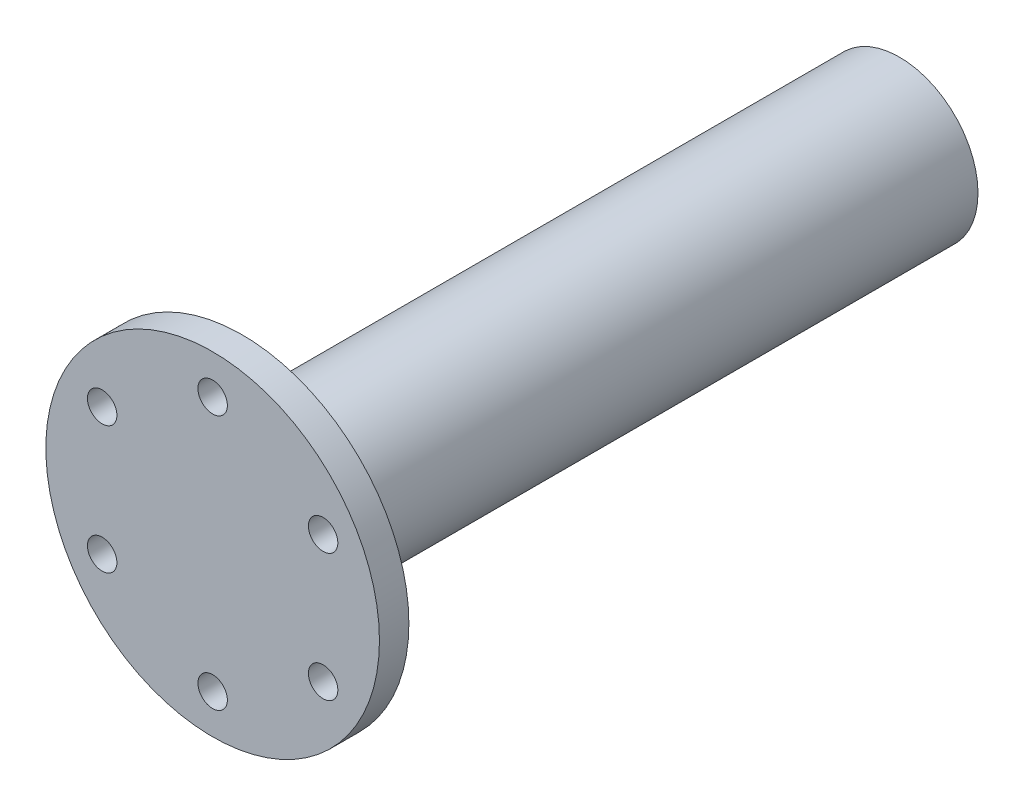
ISO-10303-21;
HEADER;
FILE_DESCRIPTION(('STEP AP214'),'2;1');
FILE_NAME('part.step','',(''),(''),'','','');
FILE_SCHEMA(('AUTOMOTIVE_DESIGN { 1 0 10303 214 1 1 1 1 }'));
ENDSEC;
DATA;
#1=APPLICATION_CONTEXT('core data for automotive mechanical design processes');
#2=APPLICATION_PROTOCOL_DEFINITION('international standard','automotive_design',2000,#1);
#3=PRODUCT_CONTEXT('',#1,'mechanical');
#4=PRODUCT('Part','Part','',(#3));
#5=PRODUCT_RELATED_PRODUCT_CATEGORY('part','',(#4));
#6=PRODUCT_DEFINITION_FORMATION('','',#4);
#7=PRODUCT_DEFINITION_CONTEXT('part definition',#1,'design');
#8=PRODUCT_DEFINITION('design','',#6,#7);
#9=PRODUCT_DEFINITION_SHAPE('','',#8);
#10=(LENGTH_UNIT() NAMED_UNIT(*) SI_UNIT(.MILLI.,.METRE.));
#11=(NAMED_UNIT(*) PLANE_ANGLE_UNIT() SI_UNIT($,.RADIAN.));
#12=(NAMED_UNIT(*) SI_UNIT($,.STERADIAN.) SOLID_ANGLE_UNIT());
#13=UNCERTAINTY_MEASURE_WITH_UNIT(LENGTH_MEASURE(1.E-05),#10,'distance_accuracy_value','');
#14=(GEOMETRIC_REPRESENTATION_CONTEXT(3) GLOBAL_UNCERTAINTY_ASSIGNED_CONTEXT((#13)) GLOBAL_UNIT_ASSIGNED_CONTEXT((#10,
#11,#12)) REPRESENTATION_CONTEXT('',''));
#15=CARTESIAN_POINT('',(0.,0.,0.));
#16=DIRECTION('',(0.,0.,1.));
#17=DIRECTION('',(1.,0.,0.));
#18=AXIS2_PLACEMENT_3D('',#15,#16,#17);
#19=CARTESIAN_POINT('',(0.,0.,70.));
#20=DIRECTION('',(0.,0.,-1.));
#21=DIRECTION('',(-1.,0.,0.));
#22=AXIS2_PLACEMENT_3D('',#19,#20,#21);
#23=CYLINDRICAL_SURFACE('',#22,17.);
#24=CARTESIAN_POINT('',(0.,0.,70.));
#25=DIRECTION('',(0.,0.,1.));
#26=DIRECTION('',(1.,0.,0.));
#27=AXIS2_PLACEMENT_3D('',#24,#25,#26);
#28=CIRCLE('',#27,17.);
#29=CARTESIAN_POINT('',(17.,0.,70.));
#30=VERTEX_POINT('',#29);
#31=EDGE_CURVE('E59',#30,#30,#28,.T.);
#32=ORIENTED_EDGE('',*,*,#31,.F.);
#33=EDGE_LOOP('',(#32));
#34=FACE_BOUND('',#33,.T.);
#35=CARTESIAN_POINT('',(0.,0.,67.));
#36=DIRECTION('',(0.,0.,1.));
#37=DIRECTION('',(1.,0.,0.));
#38=AXIS2_PLACEMENT_3D('',#35,#36,#37);
#39=CIRCLE('',#38,17.);
#40=CARTESIAN_POINT('',(17.,0.,67.));
#41=VERTEX_POINT('',#40);
#42=EDGE_CURVE('E63',#41,#41,#39,.T.);
#43=ORIENTED_EDGE('',*,*,#42,.T.);
#44=EDGE_LOOP('',(#43));
#45=FACE_BOUND('',#44,.T.);
#46=ADVANCED_FACE('F39',(#34,#45),#23,.T.);
#47=CARTESIAN_POINT('',(0.,0.,70.));
#48=DIRECTION('',(0.,0.,1.));
#49=DIRECTION('',(1.,0.,0.));
#50=AXIS2_PLACEMENT_3D('',#47,#48,#49);
#51=PLANE('',#50);
#52=CARTESIAN_POINT('',(4.77818491272209E-13,13.,70.));
#53=DIRECTION('',(0.,0.,1.));
#54=DIRECTION('',(1.,0.,0.));
#55=AXIS2_PLACEMENT_3D('',#52,#53,#54);
#56=CIRCLE('',#55,1.50000000000075);
#57=CARTESIAN_POINT('',(1.50000000000123,13.,70.));
#58=VERTEX_POINT('',#57);
#59=EDGE_CURVE('E68',#58,#58,#56,.T.);
#60=ORIENTED_EDGE('',*,*,#59,.F.);
#61=EDGE_LOOP('',(#60));
#62=FACE_BOUND('',#61,.T.);
#63=CARTESIAN_POINT('',(-11.2583302491971,6.49999999999982,70.));
#64=DIRECTION('',(0.,0.,1.));
#65=DIRECTION('',(1.,0.,0.));
#66=AXIS2_PLACEMENT_3D('',#63,#64,#65);
#67=CIRCLE('',#66,1.50000000000075);
#68=CARTESIAN_POINT('',(-9.75833024919637,6.49999999999982,70.));
#69=VERTEX_POINT('',#68);
#70=EDGE_CURVE('E165',#69,#69,#67,.T.);
#71=ORIENTED_EDGE('',*,*,#70,.F.);
#72=EDGE_LOOP('',(#71));
#73=FACE_BOUND('',#72,.T.);
#74=CARTESIAN_POINT('',(-11.2583302491969,-6.50000000000018,70.));
#75=DIRECTION('',(0.,0.,1.));
#76=DIRECTION('',(1.,0.,0.));
#77=AXIS2_PLACEMENT_3D('',#74,#75,#76);
#78=CIRCLE('',#77,1.50000000000075);
#79=CARTESIAN_POINT('',(-9.75833024919617,-6.50000000000018,70.));
#80=VERTEX_POINT('',#79);
#81=EDGE_CURVE('E57',#80,#80,#78,.T.);
#82=ORIENTED_EDGE('',*,*,#81,.F.);
#83=EDGE_LOOP('',(#82));
#84=FACE_BOUND('',#83,.T.);
#85=CARTESIAN_POINT('',(8.82137297590168E-13,-13.,70.));
#86=DIRECTION('',(0.,0.,1.));
#87=DIRECTION('',(1.,0.,0.));
#88=AXIS2_PLACEMENT_3D('',#85,#86,#87);
#89=CIRCLE('',#88,1.50000000000075);
#90=CARTESIAN_POINT('',(1.50000000000163,-13.,70.));
#91=VERTEX_POINT('',#90);
#92=EDGE_CURVE('E157',#91,#91,#89,.T.);
#93=ORIENTED_EDGE('',*,*,#92,.F.);
#94=EDGE_LOOP('',(#93));
#95=FACE_BOUND('',#94,.T.);
#96=CARTESIAN_POINT('',(11.2583302491985,-6.49999999999982,70.));
#97=DIRECTION('',(0.,0.,1.));
#98=DIRECTION('',(1.,0.,0.));
#99=AXIS2_PLACEMENT_3D('',#96,#97,#98);
#100=CIRCLE('',#99,1.50000000000075);
#101=CARTESIAN_POINT('',(12.7583302491992,-6.49999999999982,70.));
#102=VERTEX_POINT('',#101);
#103=EDGE_CURVE('E154',#102,#102,#100,.T.);
#104=ORIENTED_EDGE('',*,*,#103,.F.);
#105=EDGE_LOOP('',(#104));
#106=FACE_BOUND('',#105,.T.);
#107=CARTESIAN_POINT('',(11.2583302491983,6.50000000000018,70.));
#108=DIRECTION('',(0.,0.,1.));
#109=DIRECTION('',(1.,0.,0.));
#110=AXIS2_PLACEMENT_3D('',#107,#108,#109);
#111=CIRCLE('',#110,1.50000000000075);
#112=CARTESIAN_POINT('',(12.758330249199,6.50000000000018,70.));
#113=VERTEX_POINT('',#112);
#114=EDGE_CURVE('E150',#113,#113,#111,.T.);
#115=ORIENTED_EDGE('',*,*,#114,.F.);
#116=EDGE_LOOP('',(#115));
#117=FACE_BOUND('',#116,.T.);
#118=ORIENTED_EDGE('',*,*,#31,.T.);
#119=EDGE_LOOP('',(#118));
#120=FACE_BOUND('',#119,.T.);
#121=ADVANCED_FACE('F99',(#62,#73,#84,#95,#106,#117,#120),#51,.T.);
#122=CARTESIAN_POINT('',(0.,0.,67.));
#123=DIRECTION('',(0.,0.,1.));
#124=DIRECTION('',(1.,0.,0.));
#125=AXIS2_PLACEMENT_3D('',#122,#123,#124);
#126=PLANE('',#125);
#127=CARTESIAN_POINT('',(4.77818491272209E-13,13.,67.));
#128=DIRECTION('',(0.,0.,1.));
#129=DIRECTION('',(1.,0.,0.));
#130=AXIS2_PLACEMENT_3D('',#127,#128,#129);
#131=CIRCLE('',#130,1.50000000000075);
#132=CARTESIAN_POINT('',(1.50000000000123,13.,67.));
#133=VERTEX_POINT('',#132);
#134=EDGE_CURVE('E43',#133,#133,#131,.T.);
#135=ORIENTED_EDGE('',*,*,#134,.T.);
#136=EDGE_LOOP('',(#135));
#137=FACE_BOUND('',#136,.T.);
#138=CARTESIAN_POINT('',(-11.2583302491971,6.49999999999982,67.));
#139=DIRECTION('',(0.,0.,1.));
#140=DIRECTION('',(1.,0.,0.));
#141=AXIS2_PLACEMENT_3D('',#138,#139,#140);
#142=CIRCLE('',#141,1.50000000000075);
#143=CARTESIAN_POINT('',(-9.75833024919637,6.49999999999982,67.));
#144=VERTEX_POINT('',#143);
#145=EDGE_CURVE('E77',#144,#144,#142,.T.);
#146=ORIENTED_EDGE('',*,*,#145,.T.);
#147=EDGE_LOOP('',(#146));
#148=FACE_BOUND('',#147,.T.);
#149=CARTESIAN_POINT('',(-11.2583302491969,-6.50000000000018,67.));
#150=DIRECTION('',(0.,0.,1.));
#151=DIRECTION('',(1.,0.,0.));
#152=AXIS2_PLACEMENT_3D('',#149,#150,#151);
#153=CIRCLE('',#152,1.50000000000075);
#154=CARTESIAN_POINT('',(-9.75833024919617,-6.50000000000018,67.));
#155=VERTEX_POINT('',#154);
#156=EDGE_CURVE('E78',#155,#155,#153,.T.);
#157=ORIENTED_EDGE('',*,*,#156,.T.);
#158=EDGE_LOOP('',(#157));
#159=FACE_BOUND('',#158,.T.);
#160=CARTESIAN_POINT('',(8.82137297590168E-13,-13.,67.));
#161=DIRECTION('',(0.,0.,1.));
#162=DIRECTION('',(1.,0.,0.));
#163=AXIS2_PLACEMENT_3D('',#160,#161,#162);
#164=CIRCLE('',#163,1.50000000000075);
#165=CARTESIAN_POINT('',(1.50000000000163,-13.,67.));
#166=VERTEX_POINT('',#165);
#167=EDGE_CURVE('E71',#166,#166,#164,.T.);
#168=ORIENTED_EDGE('',*,*,#167,.T.);
#169=EDGE_LOOP('',(#168));
#170=FACE_BOUND('',#169,.T.);
#171=CARTESIAN_POINT('',(11.2583302491985,-6.49999999999982,67.));
#172=DIRECTION('',(0.,0.,1.));
#173=DIRECTION('',(1.,0.,0.));
#174=AXIS2_PLACEMENT_3D('',#171,#172,#173);
#175=CIRCLE('',#174,1.50000000000075);
#176=CARTESIAN_POINT('',(12.7583302491992,-6.49999999999982,67.));
#177=VERTEX_POINT('',#176);
#178=EDGE_CURVE('E66',#177,#177,#175,.T.);
#179=ORIENTED_EDGE('',*,*,#178,.T.);
#180=EDGE_LOOP('',(#179));
#181=FACE_BOUND('',#180,.T.);
#182=CARTESIAN_POINT('',(11.2583302491983,6.50000000000018,67.));
#183=DIRECTION('',(0.,0.,1.));
#184=DIRECTION('',(1.,0.,0.));
#185=AXIS2_PLACEMENT_3D('',#182,#183,#184);
#186=CIRCLE('',#185,1.50000000000075);
#187=CARTESIAN_POINT('',(12.758330249199,6.50000000000018,67.));
#188=VERTEX_POINT('',#187);
#189=EDGE_CURVE('E67',#188,#188,#186,.T.);
#190=ORIENTED_EDGE('',*,*,#189,.T.);
#191=EDGE_LOOP('',(#190));
#192=FACE_BOUND('',#191,.T.);
#193=CARTESIAN_POINT('',(0.,0.,67.));
#194=DIRECTION('',(0.,0.,1.));
#195=DIRECTION('',(1.,0.,0.));
#196=AXIS2_PLACEMENT_3D('',#193,#194,#195);
#197=CIRCLE('',#196,9.);
#198=CARTESIAN_POINT('',(9.,0.,67.));
#199=VERTEX_POINT('',#198);
#200=EDGE_CURVE('E50',#199,#199,#197,.F.);
#201=ORIENTED_EDGE('',*,*,#200,.F.);
#202=EDGE_LOOP('',(#201));
#203=FACE_BOUND('',#202,.T.);
#204=ORIENTED_EDGE('',*,*,#42,.F.);
#205=EDGE_LOOP('',(#204));
#206=FACE_BOUND('',#205,.T.);
#207=ADVANCED_FACE('F83',(#137,#148,#159,#170,#181,#192,#203,#206),#126,.F.);
#208=CARTESIAN_POINT('',(0.,0.,67.));
#209=DIRECTION('',(0.,0.,1.));
#210=DIRECTION('',(-1.,0.,0.));
#211=AXIS2_PLACEMENT_3D('',#208,#209,#210);
#212=CONICAL_SURFACE('',#211,9.,0.401425727958696);
#213=ORIENTED_EDGE('',*,*,#200,.T.);
#214=EDGE_LOOP('',(#213));
#215=FACE_BOUND('',#214,.T.);
#216=CARTESIAN_POINT('',(0.,0.,64.6441476341762));
#217=DIRECTION('',(0.,0.,1.));
#218=DIRECTION('',(1.,0.,0.));
#219=AXIS2_PLACEMENT_3D('',#216,#217,#218);
#220=CIRCLE('',#219,8.);
#221=CARTESIAN_POINT('',(8.,0.,64.6441476341762));
#222=VERTEX_POINT('',#221);
#223=EDGE_CURVE('E10',#222,#222,#220,.T.);
#224=ORIENTED_EDGE('',*,*,#223,.T.);
#225=EDGE_LOOP('',(#224));
#226=FACE_BOUND('',#225,.T.);
#227=ADVANCED_FACE('F111',(#215,#226),#212,.T.);
#228=CARTESIAN_POINT('',(0.,0.,0.));
#229=DIRECTION('',(0.,0.,1.));
#230=DIRECTION('',(1.,0.,0.));
#231=AXIS2_PLACEMENT_3D('',#228,#229,#230);
#232=PLANE('',#231);
#233=CARTESIAN_POINT('',(0.,0.,0.));
#234=DIRECTION('',(0.,0.,1.));
#235=DIRECTION('',(1.,0.,0.));
#236=AXIS2_PLACEMENT_3D('',#233,#234,#235);
#237=CIRCLE('',#236,8.);
#238=CARTESIAN_POINT('',(8.,0.,0.));
#239=VERTEX_POINT('',#238);
#240=EDGE_CURVE('E55',#239,#239,#237,.T.);
#241=ORIENTED_EDGE('',*,*,#240,.F.);
#242=EDGE_LOOP('',(#241));
#243=FACE_BOUND('',#242,.T.);
#244=ADVANCED_FACE('F114',(#243),#232,.F.);
#245=CARTESIAN_POINT('',(0.,0.,67.));
#246=DIRECTION('',(0.,0.,-1.));
#247=DIRECTION('',(-1.,0.,0.));
#248=AXIS2_PLACEMENT_3D('',#245,#246,#247);
#249=CYLINDRICAL_SURFACE('',#248,8.);
#250=ORIENTED_EDGE('',*,*,#240,.T.);
#251=EDGE_LOOP('',(#250));
#252=FACE_BOUND('',#251,.T.);
#253=ORIENTED_EDGE('',*,*,#223,.F.);
#254=EDGE_LOOP('',(#253));
#255=FACE_BOUND('',#254,.T.);
#256=ADVANCED_FACE('F41',(#252,#255),#249,.T.);
#257=CARTESIAN_POINT('',(11.2583302491983,6.50000000000018,65.));
#258=DIRECTION('',(0.,0.,1.));
#259=DIRECTION('',(1.,0.,0.));
#260=AXIS2_PLACEMENT_3D('',#257,#258,#259);
#261=CYLINDRICAL_SURFACE('',#260,1.50000000000075);
#262=ORIENTED_EDGE('',*,*,#114,.T.);
#263=EDGE_LOOP('',(#262));
#264=FACE_BOUND('',#263,.T.);
#265=ORIENTED_EDGE('',*,*,#189,.F.);
#266=EDGE_LOOP('',(#265));
#267=FACE_BOUND('',#266,.T.);
#268=ADVANCED_FACE('F120',(#264,#267),#261,.F.);
#269=CARTESIAN_POINT('',(11.2583302491985,-6.49999999999982,65.));
#270=DIRECTION('',(0.,0.,1.));
#271=DIRECTION('',(1.,0.,0.));
#272=AXIS2_PLACEMENT_3D('',#269,#270,#271);
#273=CYLINDRICAL_SURFACE('',#272,1.50000000000075);
#274=ORIENTED_EDGE('',*,*,#103,.T.);
#275=EDGE_LOOP('',(#274));
#276=FACE_BOUND('',#275,.T.);
#277=ORIENTED_EDGE('',*,*,#178,.F.);
#278=EDGE_LOOP('',(#277));
#279=FACE_BOUND('',#278,.T.);
#280=ADVANCED_FACE('F131',(#276,#279),#273,.F.);
#281=CARTESIAN_POINT('',(8.82137297590168E-13,-13.,65.));
#282=DIRECTION('',(0.,0.,1.));
#283=DIRECTION('',(1.,0.,0.));
#284=AXIS2_PLACEMENT_3D('',#281,#282,#283);
#285=CYLINDRICAL_SURFACE('',#284,1.50000000000075);
#286=ORIENTED_EDGE('',*,*,#92,.T.);
#287=EDGE_LOOP('',(#286));
#288=FACE_BOUND('',#287,.T.);
#289=ORIENTED_EDGE('',*,*,#167,.F.);
#290=EDGE_LOOP('',(#289));
#291=FACE_BOUND('',#290,.T.);
#292=ADVANCED_FACE('F133',(#288,#291),#285,.F.);
#293=CARTESIAN_POINT('',(-11.2583302491969,-6.50000000000018,65.));
#294=DIRECTION('',(0.,0.,1.));
#295=DIRECTION('',(1.,0.,0.));
#296=AXIS2_PLACEMENT_3D('',#293,#294,#295);
#297=CYLINDRICAL_SURFACE('',#296,1.50000000000075);
#298=ORIENTED_EDGE('',*,*,#81,.T.);
#299=EDGE_LOOP('',(#298));
#300=FACE_BOUND('',#299,.T.);
#301=ORIENTED_EDGE('',*,*,#156,.F.);
#302=EDGE_LOOP('',(#301));
#303=FACE_BOUND('',#302,.T.);
#304=ADVANCED_FACE('F92',(#300,#303),#297,.F.);
#305=CARTESIAN_POINT('',(-11.2583302491971,6.49999999999982,65.));
#306=DIRECTION('',(0.,0.,1.));
#307=DIRECTION('',(1.,0.,0.));
#308=AXIS2_PLACEMENT_3D('',#305,#306,#307);
#309=CYLINDRICAL_SURFACE('',#308,1.50000000000075);
#310=ORIENTED_EDGE('',*,*,#70,.T.);
#311=EDGE_LOOP('',(#310));
#312=FACE_BOUND('',#311,.T.);
#313=ORIENTED_EDGE('',*,*,#145,.F.);
#314=EDGE_LOOP('',(#313));
#315=FACE_BOUND('',#314,.T.);
#316=ADVANCED_FACE('F90',(#312,#315),#309,.F.);
#317=CARTESIAN_POINT('',(4.77818491272209E-13,13.,65.));
#318=DIRECTION('',(0.,0.,1.));
#319=DIRECTION('',(1.,0.,0.));
#320=AXIS2_PLACEMENT_3D('',#317,#318,#319);
#321=CYLINDRICAL_SURFACE('',#320,1.50000000000075);
#322=ORIENTED_EDGE('',*,*,#59,.T.);
#323=EDGE_LOOP('',(#322));
#324=FACE_BOUND('',#323,.T.);
#325=ORIENTED_EDGE('',*,*,#134,.F.);
#326=EDGE_LOOP('',(#325));
#327=FACE_BOUND('',#326,.T.);
#328=ADVANCED_FACE('F87',(#324,#327),#321,.F.);
#329=CLOSED_SHELL('',(#46,#121,#207,#227,#244,#256,#268,#280,#292,#304,#316,#328));
#330=MANIFOLD_SOLID_BREP('B2',#329);
#331=ADVANCED_BREP_SHAPE_REPRESENTATION('',(#18,#330),#14);
#332=SHAPE_DEFINITION_REPRESENTATION(#9,#331);
ENDSEC;
END-ISO-10303-21;
